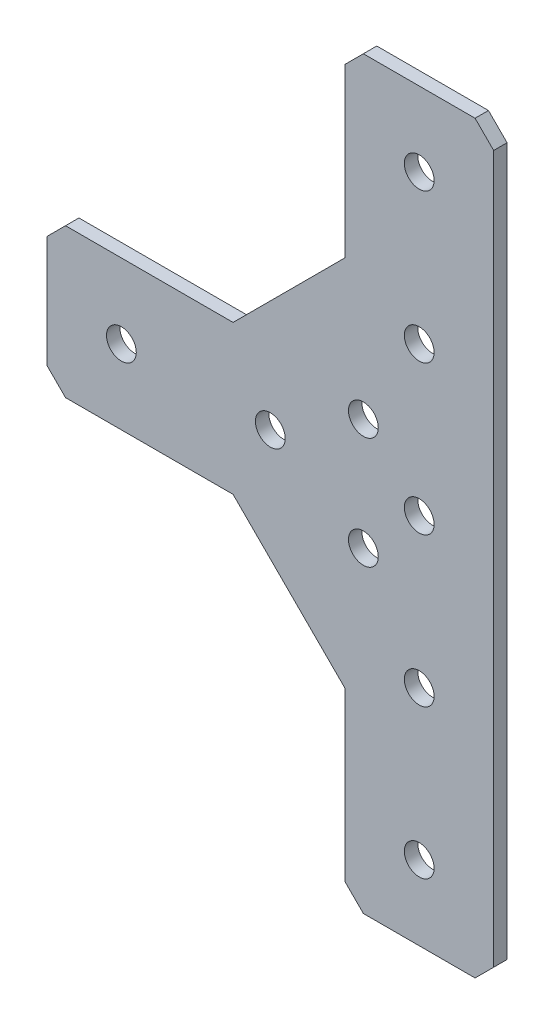
ISO-10303-21;
HEADER;
FILE_DESCRIPTION(('STEP AP214'),'2;1');
FILE_NAME('part.step','',(''),(''),'','','');
FILE_SCHEMA(('AUTOMOTIVE_DESIGN { 1 0 10303 214 1 1 1 1 }'));
ENDSEC;
DATA;
#1=APPLICATION_CONTEXT('core data for automotive mechanical design processes');
#2=APPLICATION_PROTOCOL_DEFINITION('international standard','automotive_design',2000,#1);
#3=PRODUCT_CONTEXT('',#1,'mechanical');
#4=PRODUCT('Part','Part','',(#3));
#5=PRODUCT_RELATED_PRODUCT_CATEGORY('part','',(#4));
#6=PRODUCT_DEFINITION_FORMATION('','',#4);
#7=PRODUCT_DEFINITION_CONTEXT('part definition',#1,'design');
#8=PRODUCT_DEFINITION('design','',#6,#7);
#9=PRODUCT_DEFINITION_SHAPE('','',#8);
#10=(LENGTH_UNIT() NAMED_UNIT(*) SI_UNIT(.MILLI.,.METRE.));
#11=(NAMED_UNIT(*) PLANE_ANGLE_UNIT() SI_UNIT($,.RADIAN.));
#12=(NAMED_UNIT(*) SI_UNIT($,.STERADIAN.) SOLID_ANGLE_UNIT());
#13=UNCERTAINTY_MEASURE_WITH_UNIT(LENGTH_MEASURE(1.E-05),#10,'distance_accuracy_value','');
#14=(GEOMETRIC_REPRESENTATION_CONTEXT(3) GLOBAL_UNCERTAINTY_ASSIGNED_CONTEXT((#13)) GLOBAL_UNIT_ASSIGNED_CONTEXT((#10,
#11,#12)) REPRESENTATION_CONTEXT('',''));
#15=CARTESIAN_POINT('',(0.,0.,0.));
#16=DIRECTION('',(0.,0.,1.));
#17=DIRECTION('',(1.,0.,0.));
#18=AXIS2_PLACEMENT_3D('',#15,#16,#17);
#19=CARTESIAN_POINT('',(-12.7,-31.7500000000001,0.));
#20=DIRECTION('',(-0.707106781186543,-0.707106781186552,0.));
#21=DIRECTION('',(0.707106781186552,-0.707106781186543,0.));
#22=AXIS2_PLACEMENT_3D('',#19,#20,#21);
#23=PLANE('',#22);
#24=DIRECTION('',(-0.707106781186552,0.707106781186543,0.));
#25=VECTOR('',#24,1.);
#26=CARTESIAN_POINT('',(-12.7,-31.7500000000001,-2.286));
#27=LINE('',#26,#25);
#28=CARTESIAN_POINT('',(-12.7,-31.7500000000001,-2.286));
#29=VERTEX_POINT('',#28);
#30=CARTESIAN_POINT('',(-31.7500000000002,-12.7000000000002,-2.286));
#31=VERTEX_POINT('',#30);
#32=EDGE_CURVE('E179',#29,#31,#27,.T.);
#33=ORIENTED_EDGE('',*,*,#32,.F.);
#34=DIRECTION('',(0.,0.,-1.));
#35=VECTOR('',#34,1.);
#36=CARTESIAN_POINT('',(-12.7,-31.7500000000001,0.));
#37=LINE('',#36,#35);
#38=CARTESIAN_POINT('',(-12.7,-31.7500000000001,0.));
#39=VERTEX_POINT('',#38);
#40=EDGE_CURVE('E11',#39,#29,#37,.T.);
#41=ORIENTED_EDGE('',*,*,#40,.F.);
#42=DIRECTION('',(-0.707106781186552,0.707106781186543,0.));
#43=VECTOR('',#42,1.);
#44=CARTESIAN_POINT('',(-12.7,-31.7500000000001,0.));
#45=LINE('',#44,#43);
#46=CARTESIAN_POINT('',(-31.7500000000002,-12.7000000000002,0.));
#47=VERTEX_POINT('',#46);
#48=EDGE_CURVE('E224',#39,#47,#45,.T.);
#49=ORIENTED_EDGE('',*,*,#48,.T.);
#50=DIRECTION('',(0.,0.,-1.));
#51=VECTOR('',#50,1.);
#52=CARTESIAN_POINT('',(-31.7500000000002,-12.7000000000002,0.));
#53=LINE('',#52,#51);
#54=EDGE_CURVE('E37',#47,#31,#53,.T.);
#55=ORIENTED_EDGE('',*,*,#54,.T.);
#56=EDGE_LOOP('',(#33,#41,#49,#55));
#57=FACE_BOUND('',#56,.T.);
#58=ADVANCED_FACE('F34',(#57),#23,.T.);
#59=CARTESIAN_POINT('',(-12.7,-60.3250000000001,0.));
#60=DIRECTION('',(-1.,0.,0.));
#61=DIRECTION('',(0.,-1.,0.));
#62=AXIS2_PLACEMENT_3D('',#59,#60,#61);
#63=PLANE('',#62);
#64=DIRECTION('',(0.,1.,0.));
#65=VECTOR('',#64,1.);
#66=CARTESIAN_POINT('',(-12.7,-60.3250000000001,-2.286));
#67=LINE('',#66,#65);
#68=CARTESIAN_POINT('',(-12.7,-60.3250000000001,-2.286));
#69=VERTEX_POINT('',#68);
#70=EDGE_CURVE('E222',#69,#29,#67,.T.);
#71=ORIENTED_EDGE('',*,*,#70,.F.);
#72=DIRECTION('',(0.,0.,-1.));
#73=VECTOR('',#72,1.);
#74=CARTESIAN_POINT('',(-12.7,-60.3250000000001,0.));
#75=LINE('',#74,#73);
#76=CARTESIAN_POINT('',(-12.7,-60.3250000000001,0.));
#77=VERTEX_POINT('',#76);
#78=EDGE_CURVE('E43',#77,#69,#75,.T.);
#79=ORIENTED_EDGE('',*,*,#78,.F.);
#80=DIRECTION('',(0.,1.,0.));
#81=VECTOR('',#80,1.);
#82=CARTESIAN_POINT('',(-12.7,-60.3250000000001,0.));
#83=LINE('',#82,#81);
#84=EDGE_CURVE('E169',#77,#39,#83,.T.);
#85=ORIENTED_EDGE('',*,*,#84,.T.);
#86=ORIENTED_EDGE('',*,*,#40,.T.);
#87=EDGE_LOOP('',(#71,#79,#85,#86));
#88=FACE_BOUND('',#87,.T.);
#89=ADVANCED_FACE('F252',(#88),#63,.T.);
#90=CARTESIAN_POINT('',(-9.52500000000001,-63.5000000000002,0.));
#91=DIRECTION('',(-0.707106781186549,-0.707106781186546,0.));
#92=DIRECTION('',(0.707106781186546,-0.707106781186549,0.));
#93=AXIS2_PLACEMENT_3D('',#90,#91,#92);
#94=PLANE('',#93);
#95=DIRECTION('',(-0.707106781186546,0.707106781186549,0.));
#96=VECTOR('',#95,1.);
#97=CARTESIAN_POINT('',(-9.52500000000001,-63.5000000000002,-2.286));
#98=LINE('',#97,#96);
#99=CARTESIAN_POINT('',(-9.52500000000001,-63.5000000000002,-2.286));
#100=VERTEX_POINT('',#99);
#101=EDGE_CURVE('E156',#100,#69,#98,.T.);
#102=ORIENTED_EDGE('',*,*,#101,.F.);
#103=DIRECTION('',(0.,0.,-1.));
#104=VECTOR('',#103,1.);
#105=CARTESIAN_POINT('',(-9.52500000000001,-63.5000000000002,0.));
#106=LINE('',#105,#104);
#107=CARTESIAN_POINT('',(-9.52500000000001,-63.5000000000002,0.));
#108=VERTEX_POINT('',#107);
#109=EDGE_CURVE('E151',#108,#100,#106,.T.);
#110=ORIENTED_EDGE('',*,*,#109,.F.);
#111=DIRECTION('',(-0.707106781186546,0.707106781186549,0.));
#112=VECTOR('',#111,1.);
#113=CARTESIAN_POINT('',(-9.52500000000001,-63.5000000000002,0.));
#114=LINE('',#113,#112);
#115=EDGE_CURVE('E154',#108,#77,#114,.T.);
#116=ORIENTED_EDGE('',*,*,#115,.T.);
#117=ORIENTED_EDGE('',*,*,#78,.T.);
#118=EDGE_LOOP('',(#102,#110,#116,#117));
#119=FACE_BOUND('',#118,.T.);
#120=ADVANCED_FACE('F153',(#119),#94,.T.);
#121=CARTESIAN_POINT('',(9.52500000000013,-63.5000000000002,0.));
#122=DIRECTION('',(0.,-1.,0.));
#123=DIRECTION('',(0.,0.,-1.));
#124=AXIS2_PLACEMENT_3D('',#121,#122,#123);
#125=PLANE('',#124);
#126=DIRECTION('',(-1.,0.,0.));
#127=VECTOR('',#126,1.);
#128=CARTESIAN_POINT('',(9.52500000000013,-63.5000000000002,-2.286));
#129=LINE('',#128,#127);
#130=CARTESIAN_POINT('',(9.52500000000013,-63.5000000000002,-2.286));
#131=VERTEX_POINT('',#130);
#132=EDGE_CURVE('E219',#131,#100,#129,.T.);
#133=ORIENTED_EDGE('',*,*,#132,.F.);
#134=DIRECTION('',(0.,0.,-1.));
#135=VECTOR('',#134,1.);
#136=CARTESIAN_POINT('',(9.52500000000013,-63.5000000000002,0.));
#137=LINE('',#136,#135);
#138=CARTESIAN_POINT('',(9.52500000000013,-63.5000000000002,0.));
#139=VERTEX_POINT('',#138);
#140=EDGE_CURVE('E161',#139,#131,#137,.T.);
#141=ORIENTED_EDGE('',*,*,#140,.F.);
#142=DIRECTION('',(-1.,0.,0.));
#143=VECTOR('',#142,1.);
#144=CARTESIAN_POINT('',(9.52500000000013,-63.5000000000002,0.));
#145=LINE('',#144,#143);
#146=EDGE_CURVE('E167',#139,#108,#145,.T.);
#147=ORIENTED_EDGE('',*,*,#146,.T.);
#148=ORIENTED_EDGE('',*,*,#109,.T.);
#149=EDGE_LOOP('',(#133,#141,#147,#148));
#150=FACE_BOUND('',#149,.T.);
#151=ADVANCED_FACE('F171',(#150),#125,.T.);
#152=CARTESIAN_POINT('',(12.7000000000001,-60.3250000000002,0.));
#153=DIRECTION('',(0.707106781186552,-0.707106781186543,0.));
#154=DIRECTION('',(0.707106781186543,0.707106781186552,0.));
#155=AXIS2_PLACEMENT_3D('',#152,#153,#154);
#156=PLANE('',#155);
#157=DIRECTION('',(-0.707106781186543,-0.707106781186552,0.));
#158=VECTOR('',#157,1.);
#159=CARTESIAN_POINT('',(12.7000000000001,-60.3250000000002,-2.286));
#160=LINE('',#159,#158);
#161=CARTESIAN_POINT('',(12.7000000000001,-60.3250000000002,-2.286));
#162=VERTEX_POINT('',#161);
#163=EDGE_CURVE('E216',#162,#131,#160,.T.);
#164=ORIENTED_EDGE('',*,*,#163,.F.);
#165=DIRECTION('',(0.,0.,-1.));
#166=VECTOR('',#165,1.);
#167=CARTESIAN_POINT('',(12.7000000000001,-60.3250000000002,0.));
#168=LINE('',#167,#166);
#169=CARTESIAN_POINT('',(12.7000000000001,-60.3250000000002,0.));
#170=VERTEX_POINT('',#169);
#171=EDGE_CURVE('E228',#170,#162,#168,.T.);
#172=ORIENTED_EDGE('',*,*,#171,.F.);
#173=DIRECTION('',(-0.707106781186543,-0.707106781186552,0.));
#174=VECTOR('',#173,1.);
#175=CARTESIAN_POINT('',(12.7000000000001,-60.3250000000002,0.));
#176=LINE('',#175,#174);
#177=EDGE_CURVE('E172',#170,#139,#176,.T.);
#178=ORIENTED_EDGE('',*,*,#177,.T.);
#179=ORIENTED_EDGE('',*,*,#140,.T.);
#180=EDGE_LOOP('',(#164,#172,#178,#179));
#181=FACE_BOUND('',#180,.T.);
#182=ADVANCED_FACE('F265',(#181),#156,.T.);
#183=CARTESIAN_POINT('',(12.7,60.3249999999997,0.));
#184=DIRECTION('',(1.,0.,0.));
#185=DIRECTION('',(0.,1.,0.));
#186=AXIS2_PLACEMENT_3D('',#183,#184,#185);
#187=PLANE('',#186);
#188=DIRECTION('',(0.,-1.,0.));
#189=VECTOR('',#188,1.);
#190=CARTESIAN_POINT('',(12.7,60.3249999999997,-2.286));
#191=LINE('',#190,#189);
#192=CARTESIAN_POINT('',(12.7,60.3249999999997,-2.286));
#193=VERTEX_POINT('',#192);
#194=EDGE_CURVE('E213',#193,#162,#191,.T.);
#195=ORIENTED_EDGE('',*,*,#194,.F.);
#196=DIRECTION('',(0.,0.,-1.));
#197=VECTOR('',#196,1.);
#198=CARTESIAN_POINT('',(12.7,60.3249999999997,0.));
#199=LINE('',#198,#197);
#200=CARTESIAN_POINT('',(12.7,60.3249999999997,0.));
#201=VERTEX_POINT('',#200);
#202=EDGE_CURVE('E230',#201,#193,#199,.T.);
#203=ORIENTED_EDGE('',*,*,#202,.F.);
#204=DIRECTION('',(0.,-1.,0.));
#205=VECTOR('',#204,1.);
#206=CARTESIAN_POINT('',(12.7,60.3249999999997,0.));
#207=LINE('',#206,#205);
#208=EDGE_CURVE('E174',#201,#170,#207,.T.);
#209=ORIENTED_EDGE('',*,*,#208,.T.);
#210=ORIENTED_EDGE('',*,*,#171,.T.);
#211=EDGE_LOOP('',(#195,#203,#209,#210));
#212=FACE_BOUND('',#211,.T.);
#213=ADVANCED_FACE('F268',(#212),#187,.T.);
#214=CARTESIAN_POINT('',(9.52499999999994,63.4999999999998,0.));
#215=DIRECTION('',(0.70710678118655,0.707106781186545,0.));
#216=DIRECTION('',(-0.707106781186545,0.70710678118655,0.));
#217=AXIS2_PLACEMENT_3D('',#214,#215,#216);
#218=PLANE('',#217);
#219=DIRECTION('',(0.707106781186545,-0.70710678118655,0.));
#220=VECTOR('',#219,1.);
#221=CARTESIAN_POINT('',(9.52499999999994,63.4999999999998,-2.286));
#222=LINE('',#221,#220);
#223=CARTESIAN_POINT('',(9.52499999999994,63.4999999999998,-2.286));
#224=VERTEX_POINT('',#223);
#225=EDGE_CURVE('E210',#224,#193,#222,.T.);
#226=ORIENTED_EDGE('',*,*,#225,.F.);
#227=DIRECTION('',(0.,0.,-1.));
#228=VECTOR('',#227,1.);
#229=CARTESIAN_POINT('',(9.52499999999994,63.4999999999998,0.));
#230=LINE('',#229,#228);
#231=CARTESIAN_POINT('',(9.52499999999994,63.4999999999998,0.));
#232=VERTEX_POINT('',#231);
#233=EDGE_CURVE('E232',#232,#224,#230,.T.);
#234=ORIENTED_EDGE('',*,*,#233,.F.);
#235=DIRECTION('',(0.707106781186545,-0.70710678118655,0.));
#236=VECTOR('',#235,1.);
#237=CARTESIAN_POINT('',(9.52499999999994,63.4999999999998,0.));
#238=LINE('',#237,#236);
#239=EDGE_CURVE('E440',#232,#201,#238,.T.);
#240=ORIENTED_EDGE('',*,*,#239,.T.);
#241=ORIENTED_EDGE('',*,*,#202,.T.);
#242=EDGE_LOOP('',(#226,#234,#240,#241));
#243=FACE_BOUND('',#242,.T.);
#244=ADVANCED_FACE('F272',(#243),#218,.T.);
#245=CARTESIAN_POINT('',(-9.525,63.4999999999998,0.));
#246=DIRECTION('',(0.,1.,0.));
#247=DIRECTION('',(0.,0.,1.));
#248=AXIS2_PLACEMENT_3D('',#245,#246,#247);
#249=PLANE('',#248);
#250=DIRECTION('',(1.,0.,0.));
#251=VECTOR('',#250,1.);
#252=CARTESIAN_POINT('',(-9.525,63.4999999999998,-2.286));
#253=LINE('',#252,#251);
#254=CARTESIAN_POINT('',(-9.525,63.4999999999998,-2.286));
#255=VERTEX_POINT('',#254);
#256=EDGE_CURVE('E207',#255,#224,#253,.T.);
#257=ORIENTED_EDGE('',*,*,#256,.F.);
#258=DIRECTION('',(0.,0.,-1.));
#259=VECTOR('',#258,1.);
#260=CARTESIAN_POINT('',(-9.525,63.4999999999998,0.));
#261=LINE('',#260,#259);
#262=CARTESIAN_POINT('',(-9.525,63.4999999999998,0.));
#263=VERTEX_POINT('',#262);
#264=EDGE_CURVE('E234',#263,#255,#261,.T.);
#265=ORIENTED_EDGE('',*,*,#264,.F.);
#266=DIRECTION('',(1.,0.,0.));
#267=VECTOR('',#266,1.);
#268=CARTESIAN_POINT('',(-9.525,63.4999999999998,0.));
#269=LINE('',#268,#267);
#270=EDGE_CURVE('E437',#263,#232,#269,.T.);
#271=ORIENTED_EDGE('',*,*,#270,.T.);
#272=ORIENTED_EDGE('',*,*,#233,.T.);
#273=EDGE_LOOP('',(#257,#265,#271,#272));
#274=FACE_BOUND('',#273,.T.);
#275=ADVANCED_FACE('F276',(#274),#249,.T.);
#276=CARTESIAN_POINT('',(-12.7,60.3249999999998,0.));
#277=DIRECTION('',(-0.707106781186547,0.707106781186548,0.));
#278=DIRECTION('',(-0.707106781186548,-0.707106781186547,0.));
#279=AXIS2_PLACEMENT_3D('',#276,#277,#278);
#280=PLANE('',#279);
#281=DIRECTION('',(0.707106781186548,0.707106781186547,0.));
#282=VECTOR('',#281,1.);
#283=CARTESIAN_POINT('',(-12.7,60.3249999999998,-2.286));
#284=LINE('',#283,#282);
#285=CARTESIAN_POINT('',(-12.7,60.3249999999998,-2.286));
#286=VERTEX_POINT('',#285);
#287=EDGE_CURVE('E204',#286,#255,#284,.T.);
#288=ORIENTED_EDGE('',*,*,#287,.F.);
#289=DIRECTION('',(0.,0.,-1.));
#290=VECTOR('',#289,1.);
#291=CARTESIAN_POINT('',(-12.7,60.3249999999998,0.));
#292=LINE('',#291,#290);
#293=CARTESIAN_POINT('',(-12.7,60.3249999999998,0.));
#294=VERTEX_POINT('',#293);
#295=EDGE_CURVE('E236',#294,#286,#292,.T.);
#296=ORIENTED_EDGE('',*,*,#295,.F.);
#297=DIRECTION('',(0.707106781186548,0.707106781186547,0.));
#298=VECTOR('',#297,1.);
#299=CARTESIAN_POINT('',(-12.7,60.3249999999998,0.));
#300=LINE('',#299,#298);
#301=EDGE_CURVE('E434',#294,#263,#300,.T.);
#302=ORIENTED_EDGE('',*,*,#301,.T.);
#303=ORIENTED_EDGE('',*,*,#264,.T.);
#304=EDGE_LOOP('',(#288,#296,#302,#303));
#305=FACE_BOUND('',#304,.T.);
#306=ADVANCED_FACE('F280',(#305),#280,.T.);
#307=CARTESIAN_POINT('',(-12.7,31.7499999999998,0.));
#308=DIRECTION('',(-1.,0.,0.));
#309=DIRECTION('',(0.,-1.,0.));
#310=AXIS2_PLACEMENT_3D('',#307,#308,#309);
#311=PLANE('',#310);
#312=DIRECTION('',(0.,1.,0.));
#313=VECTOR('',#312,1.);
#314=CARTESIAN_POINT('',(-12.7,31.7499999999998,-2.286));
#315=LINE('',#314,#313);
#316=CARTESIAN_POINT('',(-12.7,31.7499999999998,-2.286));
#317=VERTEX_POINT('',#316);
#318=EDGE_CURVE('E201',#317,#286,#315,.T.);
#319=ORIENTED_EDGE('',*,*,#318,.F.);
#320=DIRECTION('',(0.,0.,-1.));
#321=VECTOR('',#320,1.);
#322=CARTESIAN_POINT('',(-12.7,31.7499999999998,0.));
#323=LINE('',#322,#321);
#324=CARTESIAN_POINT('',(-12.7,31.7499999999998,0.));
#325=VERTEX_POINT('',#324);
#326=EDGE_CURVE('E238',#325,#317,#323,.T.);
#327=ORIENTED_EDGE('',*,*,#326,.F.);
#328=DIRECTION('',(0.,1.,0.));
#329=VECTOR('',#328,1.);
#330=CARTESIAN_POINT('',(-12.7,31.7499999999998,0.));
#331=LINE('',#330,#329);
#332=EDGE_CURVE('E431',#325,#294,#331,.T.);
#333=ORIENTED_EDGE('',*,*,#332,.T.);
#334=ORIENTED_EDGE('',*,*,#295,.T.);
#335=EDGE_LOOP('',(#319,#327,#333,#334));
#336=FACE_BOUND('',#335,.T.);
#337=ADVANCED_FACE('F284',(#336),#311,.T.);
#338=CARTESIAN_POINT('',(-31.7499999999999,12.6999999999998,0.));
#339=DIRECTION('',(-0.70710678118655,0.707106781186545,0.));
#340=DIRECTION('',(-0.707106781186545,-0.70710678118655,0.));
#341=AXIS2_PLACEMENT_3D('',#338,#339,#340);
#342=PLANE('',#341);
#343=DIRECTION('',(0.707106781186545,0.70710678118655,0.));
#344=VECTOR('',#343,1.);
#345=CARTESIAN_POINT('',(-31.7499999999999,12.6999999999998,-2.286));
#346=LINE('',#345,#344);
#347=CARTESIAN_POINT('',(-31.7499999999999,12.6999999999998,-2.286));
#348=VERTEX_POINT('',#347);
#349=EDGE_CURVE('E198',#348,#317,#346,.T.);
#350=ORIENTED_EDGE('',*,*,#349,.F.);
#351=DIRECTION('',(0.,0.,-1.));
#352=VECTOR('',#351,1.);
#353=CARTESIAN_POINT('',(-31.7499999999999,12.6999999999998,0.));
#354=LINE('',#353,#352);
#355=CARTESIAN_POINT('',(-31.7499999999999,12.6999999999998,0.));
#356=VERTEX_POINT('',#355);
#357=EDGE_CURVE('E240',#356,#348,#354,.T.);
#358=ORIENTED_EDGE('',*,*,#357,.F.);
#359=DIRECTION('',(0.707106781186545,0.70710678118655,0.));
#360=VECTOR('',#359,1.);
#361=CARTESIAN_POINT('',(-31.7499999999999,12.6999999999998,0.));
#362=LINE('',#361,#360);
#363=EDGE_CURVE('E428',#356,#325,#362,.T.);
#364=ORIENTED_EDGE('',*,*,#363,.T.);
#365=ORIENTED_EDGE('',*,*,#326,.T.);
#366=EDGE_LOOP('',(#350,#358,#364,#365));
#367=FACE_BOUND('',#366,.T.);
#368=ADVANCED_FACE('F288',(#367),#342,.T.);
#369=CARTESIAN_POINT('',(-60.325,12.6999999999998,0.));
#370=DIRECTION('',(0.,1.,0.));
#371=DIRECTION('',(-1.,0.,0.));
#372=AXIS2_PLACEMENT_3D('',#369,#370,#371);
#373=PLANE('',#372);
#374=DIRECTION('',(1.,0.,0.));
#375=VECTOR('',#374,1.);
#376=CARTESIAN_POINT('',(-60.325,12.6999999999998,-2.286));
#377=LINE('',#376,#375);
#378=CARTESIAN_POINT('',(-60.325,12.6999999999998,-2.286));
#379=VERTEX_POINT('',#378);
#380=EDGE_CURVE('E195',#379,#348,#377,.T.);
#381=ORIENTED_EDGE('',*,*,#380,.F.);
#382=DIRECTION('',(0.,0.,-1.));
#383=VECTOR('',#382,1.);
#384=CARTESIAN_POINT('',(-60.325,12.6999999999998,0.));
#385=LINE('',#384,#383);
#386=CARTESIAN_POINT('',(-60.325,12.6999999999998,0.));
#387=VERTEX_POINT('',#386);
#388=EDGE_CURVE('E242',#387,#379,#385,.T.);
#389=ORIENTED_EDGE('',*,*,#388,.F.);
#390=DIRECTION('',(1.,0.,0.));
#391=VECTOR('',#390,1.);
#392=CARTESIAN_POINT('',(-60.325,12.6999999999998,0.));
#393=LINE('',#392,#391);
#394=EDGE_CURVE('E425',#387,#356,#393,.T.);
#395=ORIENTED_EDGE('',*,*,#394,.T.);
#396=ORIENTED_EDGE('',*,*,#357,.T.);
#397=EDGE_LOOP('',(#381,#389,#395,#396));
#398=FACE_BOUND('',#397,.T.);
#399=ADVANCED_FACE('F292',(#398),#373,.T.);
#400=CARTESIAN_POINT('',(-63.5,9.52499999999969,0.));
#401=DIRECTION('',(-0.707106781186549,0.707106781186546,0.));
#402=DIRECTION('',(-0.707106781186546,-0.707106781186549,0.));
#403=AXIS2_PLACEMENT_3D('',#400,#401,#402);
#404=PLANE('',#403);
#405=DIRECTION('',(0.707106781186546,0.707106781186549,0.));
#406=VECTOR('',#405,1.);
#407=CARTESIAN_POINT('',(-63.5,9.52499999999969,-2.286));
#408=LINE('',#407,#406);
#409=CARTESIAN_POINT('',(-63.5,9.52499999999969,-2.286));
#410=VERTEX_POINT('',#409);
#411=EDGE_CURVE('E192',#410,#379,#408,.T.);
#412=ORIENTED_EDGE('',*,*,#411,.F.);
#413=DIRECTION('',(0.,0.,-1.));
#414=VECTOR('',#413,1.);
#415=CARTESIAN_POINT('',(-63.5,9.52499999999969,0.));
#416=LINE('',#415,#414);
#417=CARTESIAN_POINT('',(-63.5,9.52499999999969,0.));
#418=VERTEX_POINT('',#417);
#419=EDGE_CURVE('E244',#418,#410,#416,.T.);
#420=ORIENTED_EDGE('',*,*,#419,.F.);
#421=DIRECTION('',(0.707106781186546,0.707106781186549,0.));
#422=VECTOR('',#421,1.);
#423=CARTESIAN_POINT('',(-63.5,9.52499999999969,0.));
#424=LINE('',#423,#422);
#425=EDGE_CURVE('E422',#418,#387,#424,.T.);
#426=ORIENTED_EDGE('',*,*,#425,.T.);
#427=ORIENTED_EDGE('',*,*,#388,.T.);
#428=EDGE_LOOP('',(#412,#420,#426,#427));
#429=FACE_BOUND('',#428,.T.);
#430=ADVANCED_FACE('F296',(#429),#404,.T.);
#431=CARTESIAN_POINT('',(-63.5,-9.52500000000026,0.));
#432=DIRECTION('',(-1.,0.,0.));
#433=DIRECTION('',(0.,0.,1.));
#434=AXIS2_PLACEMENT_3D('',#431,#432,#433);
#435=PLANE('',#434);
#436=DIRECTION('',(0.,1.,0.));
#437=VECTOR('',#436,1.);
#438=CARTESIAN_POINT('',(-63.5,-9.52500000000026,-2.286));
#439=LINE('',#438,#437);
#440=CARTESIAN_POINT('',(-63.5,-9.52500000000026,-2.286));
#441=VERTEX_POINT('',#440);
#442=EDGE_CURVE('E189',#441,#410,#439,.T.);
#443=ORIENTED_EDGE('',*,*,#442,.F.);
#444=DIRECTION('',(0.,0.,-1.));
#445=VECTOR('',#444,1.);
#446=CARTESIAN_POINT('',(-63.5,-9.52500000000026,0.));
#447=LINE('',#446,#445);
#448=CARTESIAN_POINT('',(-63.5,-9.52500000000026,0.));
#449=VERTEX_POINT('',#448);
#450=EDGE_CURVE('E246',#449,#441,#447,.T.);
#451=ORIENTED_EDGE('',*,*,#450,.F.);
#452=DIRECTION('',(0.,1.,0.));
#453=VECTOR('',#452,1.);
#454=CARTESIAN_POINT('',(-63.5,-9.52500000000026,0.));
#455=LINE('',#454,#453);
#456=EDGE_CURVE('E419',#449,#418,#455,.T.);
#457=ORIENTED_EDGE('',*,*,#456,.T.);
#458=ORIENTED_EDGE('',*,*,#419,.T.);
#459=EDGE_LOOP('',(#443,#451,#457,#458));
#460=FACE_BOUND('',#459,.T.);
#461=ADVANCED_FACE('F300',(#460),#435,.T.);
#462=CARTESIAN_POINT('',(-60.325,-12.7000000000002,0.));
#463=DIRECTION('',(-0.707106781186544,-0.707106781186551,0.));
#464=DIRECTION('',(0.707106781186551,-0.707106781186544,0.));
#465=AXIS2_PLACEMENT_3D('',#462,#463,#464);
#466=PLANE('',#465);
#467=DIRECTION('',(-0.707106781186551,0.707106781186544,0.));
#468=VECTOR('',#467,1.);
#469=CARTESIAN_POINT('',(-60.325,-12.7000000000002,-2.286));
#470=LINE('',#469,#468);
#471=CARTESIAN_POINT('',(-60.325,-12.7000000000002,-2.286));
#472=VERTEX_POINT('',#471);
#473=EDGE_CURVE('E186',#472,#441,#470,.T.);
#474=ORIENTED_EDGE('',*,*,#473,.F.);
#475=DIRECTION('',(0.,0.,-1.));
#476=VECTOR('',#475,1.);
#477=CARTESIAN_POINT('',(-60.325,-12.7000000000002,0.));
#478=LINE('',#477,#476);
#479=CARTESIAN_POINT('',(-60.325,-12.7000000000002,0.));
#480=VERTEX_POINT('',#479);
#481=EDGE_CURVE('E247',#480,#472,#478,.T.);
#482=ORIENTED_EDGE('',*,*,#481,.F.);
#483=DIRECTION('',(-0.707106781186551,0.707106781186544,0.));
#484=VECTOR('',#483,1.);
#485=CARTESIAN_POINT('',(-60.325,-12.7000000000002,0.));
#486=LINE('',#485,#484);
#487=EDGE_CURVE('E416',#480,#449,#486,.T.);
#488=ORIENTED_EDGE('',*,*,#487,.T.);
#489=ORIENTED_EDGE('',*,*,#450,.T.);
#490=EDGE_LOOP('',(#474,#482,#488,#489));
#491=FACE_BOUND('',#490,.T.);
#492=ADVANCED_FACE('F304',(#491),#466,.T.);
#493=CARTESIAN_POINT('',(-31.7500000000002,-12.7000000000002,0.));
#494=DIRECTION('',(0.,-1.,0.));
#495=DIRECTION('',(1.,0.,0.));
#496=AXIS2_PLACEMENT_3D('',#493,#494,#495);
#497=PLANE('',#496);
#498=DIRECTION('',(-1.,0.,0.));
#499=VECTOR('',#498,1.);
#500=CARTESIAN_POINT('',(-31.7500000000002,-12.7000000000002,-2.286));
#501=LINE('',#500,#499);
#502=EDGE_CURVE('E182',#31,#472,#501,.T.);
#503=ORIENTED_EDGE('',*,*,#502,.F.);
#504=ORIENTED_EDGE('',*,*,#54,.F.);
#505=DIRECTION('',(-1.,0.,0.));
#506=VECTOR('',#505,1.);
#507=CARTESIAN_POINT('',(-31.7500000000002,-12.7000000000002,0.));
#508=LINE('',#507,#506);
#509=EDGE_CURVE('E414',#47,#480,#508,.T.);
#510=ORIENTED_EDGE('',*,*,#509,.T.);
#511=ORIENTED_EDGE('',*,*,#481,.T.);
#512=EDGE_LOOP('',(#503,#504,#510,#511));
#513=FACE_BOUND('',#512,.T.);
#514=ADVANCED_FACE('F249',(#513),#497,.T.);
#515=CARTESIAN_POINT('',(0.,0.,0.));
#516=DIRECTION('',(0.,0.,-1.));
#517=DIRECTION('',(-1.,0.,0.));
#518=AXIS2_PLACEMENT_3D('',#515,#516,#517);
#519=PLANE('',#518);
#520=CARTESIAN_POINT('',(-9.525,9.525,0.));
#521=DIRECTION('',(0.,0.,-1.));
#522=DIRECTION('',(1.,0.,0.));
#523=AXIS2_PLACEMENT_3D('',#520,#521,#522);
#524=CIRCLE('',#523,2.54);
#525=CARTESIAN_POINT('',(-6.985,9.525,0.));
#526=VERTEX_POINT('',#525);
#527=EDGE_CURVE('E359',#526,#526,#524,.T.);
#528=ORIENTED_EDGE('',*,*,#527,.T.);
#529=EDGE_LOOP('',(#528));
#530=FACE_BOUND('',#529,.T.);
#531=CARTESIAN_POINT('',(-9.525,-9.525,0.));
#532=DIRECTION('',(0.,0.,-1.));
#533=DIRECTION('',(1.,0.,0.));
#534=AXIS2_PLACEMENT_3D('',#531,#532,#533);
#535=CIRCLE('',#534,2.54);
#536=CARTESIAN_POINT('',(-6.985,-9.525,0.));
#537=VERTEX_POINT('',#536);
#538=EDGE_CURVE('E367',#537,#537,#535,.T.);
#539=ORIENTED_EDGE('',*,*,#538,.T.);
#540=EDGE_LOOP('',(#539));
#541=FACE_BOUND('',#540,.T.);
#542=CARTESIAN_POINT('',(-25.4,-1.99493199737333E-13,0.));
#543=DIRECTION('',(0.,0.,-1.));
#544=DIRECTION('',(1.,0.,0.));
#545=AXIS2_PLACEMENT_3D('',#542,#543,#544);
#546=CIRCLE('',#545,2.53999999999999);
#547=CARTESIAN_POINT('',(-22.86,-1.99493199737333E-13,0.));
#548=VERTEX_POINT('',#547);
#549=EDGE_CURVE('E373',#548,#548,#546,.T.);
#550=ORIENTED_EDGE('',*,*,#549,.T.);
#551=EDGE_LOOP('',(#550));
#552=FACE_BOUND('',#551,.T.);
#553=CARTESIAN_POINT('',(-50.8,-1.99493199737333E-13,0.));
#554=DIRECTION('',(0.,0.,-1.));
#555=DIRECTION('',(1.,0.,0.));
#556=AXIS2_PLACEMENT_3D('',#553,#554,#555);
#557=CIRCLE('',#556,2.53999999999999);
#558=CARTESIAN_POINT('',(-48.26,-1.99493199737333E-13,0.));
#559=VERTEX_POINT('',#558);
#560=EDGE_CURVE('E379',#559,#559,#557,.T.);
#561=ORIENTED_EDGE('',*,*,#560,.T.);
#562=EDGE_LOOP('',(#561));
#563=FACE_BOUND('',#562,.T.);
#564=CARTESIAN_POINT('',(0.,25.3999999999998,0.));
#565=DIRECTION('',(0.,0.,-1.));
#566=DIRECTION('',(1.,0.,0.));
#567=AXIS2_PLACEMENT_3D('',#564,#565,#566);
#568=CIRCLE('',#567,2.54);
#569=CARTESIAN_POINT('',(2.54000000000001,25.3999999999998,0.));
#570=VERTEX_POINT('',#569);
#571=EDGE_CURVE('E385',#570,#570,#568,.T.);
#572=ORIENTED_EDGE('',*,*,#571,.T.);
#573=EDGE_LOOP('',(#572));
#574=FACE_BOUND('',#573,.T.);
#575=CARTESIAN_POINT('',(0.,50.7999999999998,0.));
#576=DIRECTION('',(0.,0.,-1.));
#577=DIRECTION('',(1.,0.,0.));
#578=AXIS2_PLACEMENT_3D('',#575,#576,#577);
#579=CIRCLE('',#578,2.54);
#580=CARTESIAN_POINT('',(2.54,50.7999999999998,0.));
#581=VERTEX_POINT('',#580);
#582=EDGE_CURVE('E391',#581,#581,#579,.T.);
#583=ORIENTED_EDGE('',*,*,#582,.T.);
#584=EDGE_LOOP('',(#583));
#585=FACE_BOUND('',#584,.T.);
#586=CARTESIAN_POINT('',(0.,-1.80411241501588E-13,0.));
#587=DIRECTION('',(0.,0.,-1.));
#588=DIRECTION('',(1.,0.,0.));
#589=AXIS2_PLACEMENT_3D('',#586,#587,#588);
#590=CIRCLE('',#589,2.54);
#591=CARTESIAN_POINT('',(2.54000000000001,-1.80411241501588E-13,0.));
#592=VERTEX_POINT('',#591);
#593=EDGE_CURVE('E397',#592,#592,#590,.T.);
#594=ORIENTED_EDGE('',*,*,#593,.T.);
#595=EDGE_LOOP('',(#594));
#596=FACE_BOUND('',#595,.T.);
#597=CARTESIAN_POINT('',(0.,-25.4000000000002,0.));
#598=DIRECTION('',(0.,0.,-1.));
#599=DIRECTION('',(1.,0.,0.));
#600=AXIS2_PLACEMENT_3D('',#597,#598,#599);
#601=CIRCLE('',#600,2.54);
#602=CARTESIAN_POINT('',(2.54000000000001,-25.4000000000002,0.));
#603=VERTEX_POINT('',#602);
#604=EDGE_CURVE('E403',#603,#603,#601,.T.);
#605=ORIENTED_EDGE('',*,*,#604,.T.);
#606=EDGE_LOOP('',(#605));
#607=FACE_BOUND('',#606,.T.);
#608=CARTESIAN_POINT('',(0.,-50.8000000000002,0.));
#609=DIRECTION('',(0.,0.,-1.));
#610=DIRECTION('',(1.,0.,0.));
#611=AXIS2_PLACEMENT_3D('',#608,#609,#610);
#612=CIRCLE('',#611,2.54);
#613=CARTESIAN_POINT('',(2.54000000000002,-50.8000000000002,0.));
#614=VERTEX_POINT('',#613);
#615=EDGE_CURVE('E183',#614,#614,#612,.T.);
#616=ORIENTED_EDGE('',*,*,#615,.T.);
#617=EDGE_LOOP('',(#616));
#618=FACE_BOUND('',#617,.T.);
#619=ORIENTED_EDGE('',*,*,#48,.F.);
#620=ORIENTED_EDGE('',*,*,#84,.F.);
#621=ORIENTED_EDGE('',*,*,#115,.F.);
#622=ORIENTED_EDGE('',*,*,#146,.F.);
#623=ORIENTED_EDGE('',*,*,#177,.F.);
#624=ORIENTED_EDGE('',*,*,#208,.F.);
#625=ORIENTED_EDGE('',*,*,#239,.F.);
#626=ORIENTED_EDGE('',*,*,#270,.F.);
#627=ORIENTED_EDGE('',*,*,#301,.F.);
#628=ORIENTED_EDGE('',*,*,#332,.F.);
#629=ORIENTED_EDGE('',*,*,#363,.F.);
#630=ORIENTED_EDGE('',*,*,#394,.F.);
#631=ORIENTED_EDGE('',*,*,#425,.F.);
#632=ORIENTED_EDGE('',*,*,#456,.F.);
#633=ORIENTED_EDGE('',*,*,#487,.F.);
#634=ORIENTED_EDGE('',*,*,#509,.F.);
#635=EDGE_LOOP('',(#619,#620,#621,#622,#623,#624,#625,#626,#627,#628,#629,#630,#631,#632,#633,#634));
#636=FACE_BOUND('',#635,.T.);
#637=ADVANCED_FACE('F165',(#530,#541,#552,#563,#574,#585,#596,#607,#618,#636),#519,.F.);
#638=CARTESIAN_POINT('',(0.,0.,-2.286));
#639=DIRECTION('',(0.,0.,-1.));
#640=DIRECTION('',(-1.,0.,0.));
#641=AXIS2_PLACEMENT_3D('',#638,#639,#640);
#642=PLANE('',#641);
#643=CARTESIAN_POINT('',(-9.525,9.525,-2.286));
#644=DIRECTION('',(0.,0.,-1.));
#645=DIRECTION('',(1.,0.,0.));
#646=AXIS2_PLACEMENT_3D('',#643,#644,#645);
#647=CIRCLE('',#646,2.54);
#648=CARTESIAN_POINT('',(-6.985,9.525,-2.286));
#649=VERTEX_POINT('',#648);
#650=EDGE_CURVE('E362',#649,#649,#647,.T.);
#651=ORIENTED_EDGE('',*,*,#650,.F.);
#652=EDGE_LOOP('',(#651));
#653=FACE_BOUND('',#652,.T.);
#654=CARTESIAN_POINT('',(-9.525,-9.525,-2.286));
#655=DIRECTION('',(0.,0.,-1.));
#656=DIRECTION('',(1.,0.,0.));
#657=AXIS2_PLACEMENT_3D('',#654,#655,#656);
#658=CIRCLE('',#657,2.54);
#659=CARTESIAN_POINT('',(-6.985,-9.525,-2.286));
#660=VERTEX_POINT('',#659);
#661=EDGE_CURVE('E364',#660,#660,#658,.T.);
#662=ORIENTED_EDGE('',*,*,#661,.F.);
#663=EDGE_LOOP('',(#662));
#664=FACE_BOUND('',#663,.T.);
#665=CARTESIAN_POINT('',(-25.4,-1.99493199737333E-13,-2.286));
#666=DIRECTION('',(0.,0.,-1.));
#667=DIRECTION('',(1.,0.,0.));
#668=AXIS2_PLACEMENT_3D('',#665,#666,#667);
#669=CIRCLE('',#668,2.53999999999999);
#670=CARTESIAN_POINT('',(-22.86,-1.99493199737333E-13,-2.286));
#671=VERTEX_POINT('',#670);
#672=EDGE_CURVE('E370',#671,#671,#669,.T.);
#673=ORIENTED_EDGE('',*,*,#672,.F.);
#674=EDGE_LOOP('',(#673));
#675=FACE_BOUND('',#674,.T.);
#676=CARTESIAN_POINT('',(-50.8,-1.99493199737333E-13,-2.286));
#677=DIRECTION('',(0.,0.,-1.));
#678=DIRECTION('',(1.,0.,0.));
#679=AXIS2_PLACEMENT_3D('',#676,#677,#678);
#680=CIRCLE('',#679,2.53999999999999);
#681=CARTESIAN_POINT('',(-48.26,-1.99493199737333E-13,-2.286));
#682=VERTEX_POINT('',#681);
#683=EDGE_CURVE('E376',#682,#682,#680,.T.);
#684=ORIENTED_EDGE('',*,*,#683,.F.);
#685=EDGE_LOOP('',(#684));
#686=FACE_BOUND('',#685,.T.);
#687=CARTESIAN_POINT('',(0.,25.3999999999998,-2.286));
#688=DIRECTION('',(0.,0.,-1.));
#689=DIRECTION('',(1.,0.,0.));
#690=AXIS2_PLACEMENT_3D('',#687,#688,#689);
#691=CIRCLE('',#690,2.54);
#692=CARTESIAN_POINT('',(2.54000000000001,25.3999999999998,-2.286));
#693=VERTEX_POINT('',#692);
#694=EDGE_CURVE('E382',#693,#693,#691,.T.);
#695=ORIENTED_EDGE('',*,*,#694,.F.);
#696=EDGE_LOOP('',(#695));
#697=FACE_BOUND('',#696,.T.);
#698=CARTESIAN_POINT('',(0.,50.7999999999998,-2.286));
#699=DIRECTION('',(0.,0.,-1.));
#700=DIRECTION('',(1.,0.,0.));
#701=AXIS2_PLACEMENT_3D('',#698,#699,#700);
#702=CIRCLE('',#701,2.54);
#703=CARTESIAN_POINT('',(2.54,50.7999999999998,-2.286));
#704=VERTEX_POINT('',#703);
#705=EDGE_CURVE('E388',#704,#704,#702,.T.);
#706=ORIENTED_EDGE('',*,*,#705,.F.);
#707=EDGE_LOOP('',(#706));
#708=FACE_BOUND('',#707,.T.);
#709=CARTESIAN_POINT('',(0.,-1.80411241501588E-13,-2.286));
#710=DIRECTION('',(0.,0.,-1.));
#711=DIRECTION('',(1.,0.,0.));
#712=AXIS2_PLACEMENT_3D('',#709,#710,#711);
#713=CIRCLE('',#712,2.54);
#714=CARTESIAN_POINT('',(2.54000000000001,-1.80411241501588E-13,-2.286));
#715=VERTEX_POINT('',#714);
#716=EDGE_CURVE('E394',#715,#715,#713,.T.);
#717=ORIENTED_EDGE('',*,*,#716,.F.);
#718=EDGE_LOOP('',(#717));
#719=FACE_BOUND('',#718,.T.);
#720=CARTESIAN_POINT('',(0.,-25.4000000000002,-2.286));
#721=DIRECTION('',(0.,0.,-1.));
#722=DIRECTION('',(1.,0.,0.));
#723=AXIS2_PLACEMENT_3D('',#720,#721,#722);
#724=CIRCLE('',#723,2.54);
#725=CARTESIAN_POINT('',(2.54000000000001,-25.4000000000002,-2.286));
#726=VERTEX_POINT('',#725);
#727=EDGE_CURVE('E400',#726,#726,#724,.T.);
#728=ORIENTED_EDGE('',*,*,#727,.F.);
#729=EDGE_LOOP('',(#728));
#730=FACE_BOUND('',#729,.T.);
#731=CARTESIAN_POINT('',(0.,-50.8000000000002,-2.286));
#732=DIRECTION('',(0.,0.,-1.));
#733=DIRECTION('',(1.,0.,0.));
#734=AXIS2_PLACEMENT_3D('',#731,#732,#733);
#735=CIRCLE('',#734,2.54);
#736=CARTESIAN_POINT('',(2.54000000000002,-50.8000000000002,-2.286));
#737=VERTEX_POINT('',#736);
#738=EDGE_CURVE('E406',#737,#737,#735,.T.);
#739=ORIENTED_EDGE('',*,*,#738,.F.);
#740=EDGE_LOOP('',(#739));
#741=FACE_BOUND('',#740,.T.);
#742=ORIENTED_EDGE('',*,*,#32,.T.);
#743=ORIENTED_EDGE('',*,*,#502,.T.);
#744=ORIENTED_EDGE('',*,*,#473,.T.);
#745=ORIENTED_EDGE('',*,*,#442,.T.);
#746=ORIENTED_EDGE('',*,*,#411,.T.);
#747=ORIENTED_EDGE('',*,*,#380,.T.);
#748=ORIENTED_EDGE('',*,*,#349,.T.);
#749=ORIENTED_EDGE('',*,*,#318,.T.);
#750=ORIENTED_EDGE('',*,*,#287,.T.);
#751=ORIENTED_EDGE('',*,*,#256,.T.);
#752=ORIENTED_EDGE('',*,*,#225,.T.);
#753=ORIENTED_EDGE('',*,*,#194,.T.);
#754=ORIENTED_EDGE('',*,*,#163,.T.);
#755=ORIENTED_EDGE('',*,*,#132,.T.);
#756=ORIENTED_EDGE('',*,*,#101,.T.);
#757=ORIENTED_EDGE('',*,*,#70,.T.);
#758=EDGE_LOOP('',(#742,#743,#744,#745,#746,#747,#748,#749,#750,#751,#752,#753,#754,#755,#756,#757));
#759=FACE_BOUND('',#758,.T.);
#760=ADVANCED_FACE('F251',(#653,#664,#675,#686,#697,#708,#719,#730,#741,#759),#642,.T.);
#761=CARTESIAN_POINT('',(0.,-50.8000000000002,0.));
#762=DIRECTION('',(0.,0.,-1.));
#763=DIRECTION('',(-1.,0.,0.));
#764=AXIS2_PLACEMENT_3D('',#761,#762,#763);
#765=CYLINDRICAL_SURFACE('',#764,2.54);
#766=ORIENTED_EDGE('',*,*,#615,.F.);
#767=EDGE_LOOP('',(#766));
#768=FACE_BOUND('',#767,.T.);
#769=ORIENTED_EDGE('',*,*,#738,.T.);
#770=EDGE_LOOP('',(#769));
#771=FACE_BOUND('',#770,.T.);
#772=ADVANCED_FACE('F316',(#768,#771),#765,.F.);
#773=CARTESIAN_POINT('',(0.,-25.4000000000002,0.));
#774=DIRECTION('',(0.,0.,-1.));
#775=DIRECTION('',(-1.,0.,0.));
#776=AXIS2_PLACEMENT_3D('',#773,#774,#775);
#777=CYLINDRICAL_SURFACE('',#776,2.54);
#778=ORIENTED_EDGE('',*,*,#604,.F.);
#779=EDGE_LOOP('',(#778));
#780=FACE_BOUND('',#779,.T.);
#781=ORIENTED_EDGE('',*,*,#727,.T.);
#782=EDGE_LOOP('',(#781));
#783=FACE_BOUND('',#782,.T.);
#784=ADVANCED_FACE('F323',(#780,#783),#777,.F.);
#785=CARTESIAN_POINT('',(0.,-1.80411241501588E-13,0.));
#786=DIRECTION('',(0.,0.,-1.));
#787=DIRECTION('',(-1.,0.,0.));
#788=AXIS2_PLACEMENT_3D('',#785,#786,#787);
#789=CYLINDRICAL_SURFACE('',#788,2.54);
#790=ORIENTED_EDGE('',*,*,#593,.F.);
#791=EDGE_LOOP('',(#790));
#792=FACE_BOUND('',#791,.T.);
#793=ORIENTED_EDGE('',*,*,#716,.T.);
#794=EDGE_LOOP('',(#793));
#795=FACE_BOUND('',#794,.T.);
#796=ADVANCED_FACE('F327',(#792,#795),#789,.F.);
#797=CARTESIAN_POINT('',(0.,50.7999999999998,0.));
#798=DIRECTION('',(0.,0.,-1.));
#799=DIRECTION('',(-1.,0.,0.));
#800=AXIS2_PLACEMENT_3D('',#797,#798,#799);
#801=CYLINDRICAL_SURFACE('',#800,2.54);
#802=ORIENTED_EDGE('',*,*,#582,.F.);
#803=EDGE_LOOP('',(#802));
#804=FACE_BOUND('',#803,.T.);
#805=ORIENTED_EDGE('',*,*,#705,.T.);
#806=EDGE_LOOP('',(#805));
#807=FACE_BOUND('',#806,.T.);
#808=ADVANCED_FACE('F331',(#804,#807),#801,.F.);
#809=CARTESIAN_POINT('',(0.,25.3999999999998,0.));
#810=DIRECTION('',(0.,0.,-1.));
#811=DIRECTION('',(-1.,0.,0.));
#812=AXIS2_PLACEMENT_3D('',#809,#810,#811);
#813=CYLINDRICAL_SURFACE('',#812,2.54);
#814=ORIENTED_EDGE('',*,*,#571,.F.);
#815=EDGE_LOOP('',(#814));
#816=FACE_BOUND('',#815,.T.);
#817=ORIENTED_EDGE('',*,*,#694,.T.);
#818=EDGE_LOOP('',(#817));
#819=FACE_BOUND('',#818,.T.);
#820=ADVANCED_FACE('F335',(#816,#819),#813,.F.);
#821=CARTESIAN_POINT('',(-50.8,-1.99493199737333E-13,0.));
#822=DIRECTION('',(0.,0.,-1.));
#823=DIRECTION('',(-1.,0.,0.));
#824=AXIS2_PLACEMENT_3D('',#821,#822,#823);
#825=CYLINDRICAL_SURFACE('',#824,2.53999999999999);
#826=ORIENTED_EDGE('',*,*,#560,.F.);
#827=EDGE_LOOP('',(#826));
#828=FACE_BOUND('',#827,.T.);
#829=ORIENTED_EDGE('',*,*,#683,.T.);
#830=EDGE_LOOP('',(#829));
#831=FACE_BOUND('',#830,.T.);
#832=ADVANCED_FACE('F339',(#828,#831),#825,.F.);
#833=CARTESIAN_POINT('',(-25.4,-1.99493199737333E-13,0.));
#834=DIRECTION('',(0.,0.,-1.));
#835=DIRECTION('',(-1.,0.,0.));
#836=AXIS2_PLACEMENT_3D('',#833,#834,#835);
#837=CYLINDRICAL_SURFACE('',#836,2.53999999999999);
#838=ORIENTED_EDGE('',*,*,#549,.F.);
#839=EDGE_LOOP('',(#838));
#840=FACE_BOUND('',#839,.T.);
#841=ORIENTED_EDGE('',*,*,#672,.T.);
#842=EDGE_LOOP('',(#841));
#843=FACE_BOUND('',#842,.T.);
#844=ADVANCED_FACE('F343',(#840,#843),#837,.F.);
#845=CARTESIAN_POINT('',(-9.525,-9.525,0.));
#846=DIRECTION('',(0.,0.,-1.));
#847=DIRECTION('',(-1.,0.,0.));
#848=AXIS2_PLACEMENT_3D('',#845,#846,#847);
#849=CYLINDRICAL_SURFACE('',#848,2.54);
#850=ORIENTED_EDGE('',*,*,#538,.F.);
#851=EDGE_LOOP('',(#850));
#852=FACE_BOUND('',#851,.T.);
#853=ORIENTED_EDGE('',*,*,#661,.T.);
#854=EDGE_LOOP('',(#853));
#855=FACE_BOUND('',#854,.T.);
#856=ADVANCED_FACE('F347',(#852,#855),#849,.F.);
#857=CARTESIAN_POINT('',(-9.525,9.525,0.));
#858=DIRECTION('',(0.,0.,-1.));
#859=DIRECTION('',(-1.,0.,0.));
#860=AXIS2_PLACEMENT_3D('',#857,#858,#859);
#861=CYLINDRICAL_SURFACE('',#860,2.54);
#862=ORIENTED_EDGE('',*,*,#527,.F.);
#863=EDGE_LOOP('',(#862));
#864=FACE_BOUND('',#863,.T.);
#865=ORIENTED_EDGE('',*,*,#650,.T.);
#866=EDGE_LOOP('',(#865));
#867=FACE_BOUND('',#866,.T.);
#868=ADVANCED_FACE('F351',(#864,#867),#861,.F.);
#869=CLOSED_SHELL('',(#58,#89,#120,#151,#182,#213,#244,#275,#306,#337,#368,#399,#430,#461,#492,
#514,#637,#760,#772,#784,#796,#808,#820,#832,#844,#856,#868));
#870=MANIFOLD_SOLID_BREP('B2',#869);
#871=ADVANCED_BREP_SHAPE_REPRESENTATION('',(#18,#870),#14);
#872=SHAPE_DEFINITION_REPRESENTATION(#9,#871);
ENDSEC;
END-ISO-10303-21;
